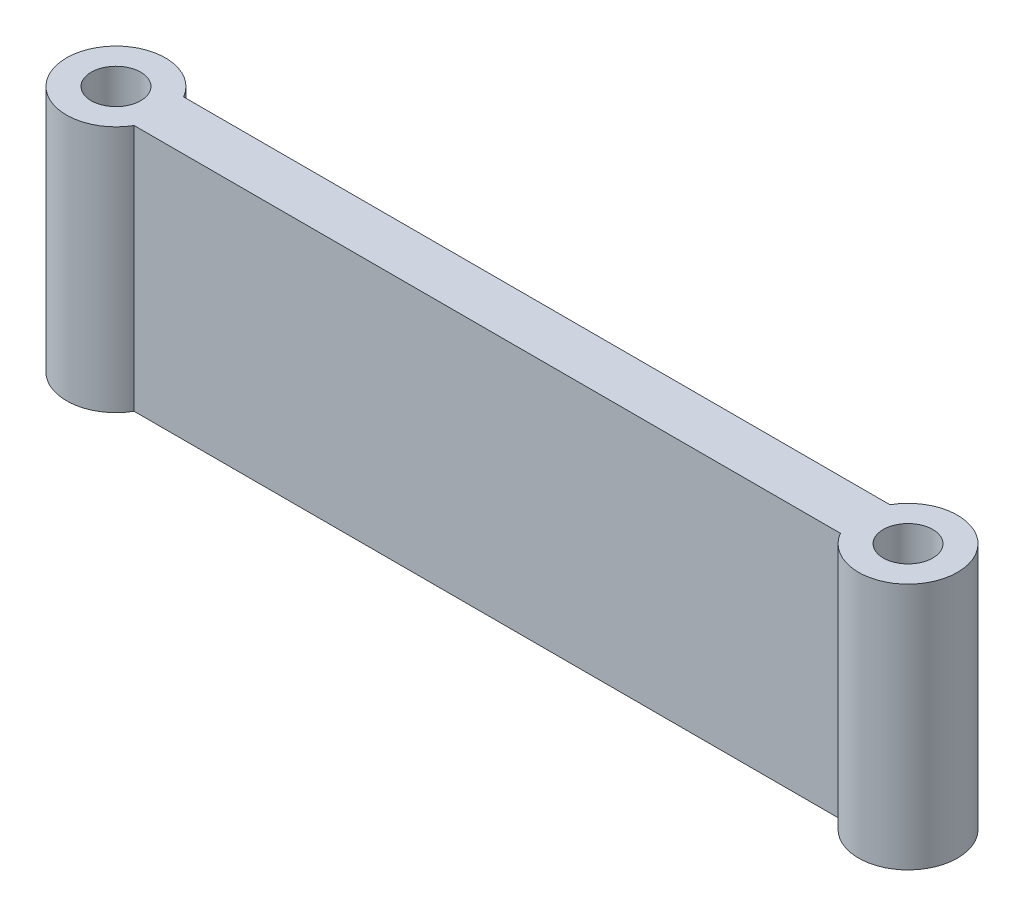
ISO-10303-21;
HEADER;
FILE_DESCRIPTION(('STEP AP214'),'2;1');
FILE_NAME('part.step','',(''),(''),'','','');
FILE_SCHEMA(('AUTOMOTIVE_DESIGN { 1 0 10303 214 1 1 1 1 }'));
ENDSEC;
DATA;
#1=APPLICATION_CONTEXT('core data for automotive mechanical design processes');
#2=APPLICATION_PROTOCOL_DEFINITION('international standard','automotive_design',2000,#1);
#3=PRODUCT_CONTEXT('',#1,'mechanical');
#4=PRODUCT('Part','Part','',(#3));
#5=PRODUCT_RELATED_PRODUCT_CATEGORY('part','',(#4));
#6=PRODUCT_DEFINITION_FORMATION('','',#4);
#7=PRODUCT_DEFINITION_CONTEXT('part definition',#1,'design');
#8=PRODUCT_DEFINITION('design','',#6,#7);
#9=PRODUCT_DEFINITION_SHAPE('','',#8);
#10=(LENGTH_UNIT() NAMED_UNIT(*) SI_UNIT(.MILLI.,.METRE.));
#11=(NAMED_UNIT(*) PLANE_ANGLE_UNIT() SI_UNIT($,.RADIAN.));
#12=(NAMED_UNIT(*) SI_UNIT($,.STERADIAN.) SOLID_ANGLE_UNIT());
#13=UNCERTAINTY_MEASURE_WITH_UNIT(LENGTH_MEASURE(1.E-05),#10,'distance_accuracy_value','');
#14=(GEOMETRIC_REPRESENTATION_CONTEXT(3) GLOBAL_UNCERTAINTY_ASSIGNED_CONTEXT((#13)) GLOBAL_UNIT_ASSIGNED_CONTEXT((#10,
#11,#12)) REPRESENTATION_CONTEXT('',''));
#15=CARTESIAN_POINT('',(0.,0.,0.));
#16=DIRECTION('',(0.,0.,1.));
#17=DIRECTION('',(1.,0.,0.));
#18=AXIS2_PLACEMENT_3D('',#15,#16,#17);
#19=CARTESIAN_POINT('',(0.,12.5,0.));
#20=DIRECTION('',(0.,1.,0.));
#21=DIRECTION('',(0.,0.,1.));
#22=AXIS2_PLACEMENT_3D('',#19,#20,#21);
#23=PLANE('',#22);
#24=CARTESIAN_POINT('',(0.,12.5,0.));
#25=DIRECTION('',(0.,1.,0.));
#26=DIRECTION('',(0.,0.,1.));
#27=AXIS2_PLACEMENT_3D('',#24,#25,#26);
#28=CIRCLE('',#27,2.5);
#29=CARTESIAN_POINT('',(0.,12.5,2.5));
#30=VERTEX_POINT('',#29);
#31=EDGE_CURVE('E102',#30,#30,#28,.T.);
#32=ORIENTED_EDGE('',*,*,#31,.F.);
#33=EDGE_LOOP('',(#32));
#34=FACE_BOUND('',#33,.T.);
#35=CARTESIAN_POINT('',(0.,12.5,0.));
#36=DIRECTION('',(0.,1.,0.));
#37=DIRECTION('',(0.,0.,1.));
#38=AXIS2_PLACEMENT_3D('',#35,#36,#37);
#39=CIRCLE('',#38,5.);
#40=CARTESIAN_POINT('',(4.33012701892219,12.5,-2.5));
#41=VERTEX_POINT('',#40);
#42=CARTESIAN_POINT('',(4.33012701892219,12.5,2.5));
#43=VERTEX_POINT('',#42);
#44=EDGE_CURVE('E87',#41,#43,#39,.T.);
#45=ORIENTED_EDGE('',*,*,#44,.T.);
#46=DIRECTION('',(1.,0.,0.));
#47=VECTOR('',#46,1.);
#48=CARTESIAN_POINT('',(4.33012701892219,12.5,2.5));
#49=LINE('',#48,#47);
#50=CARTESIAN_POINT('',(75.6698729810778,12.5,2.5));
#51=VERTEX_POINT('',#50);
#52=EDGE_CURVE('E82',#43,#51,#49,.T.);
#53=ORIENTED_EDGE('',*,*,#52,.T.);
#54=CARTESIAN_POINT('',(80.,12.5,0.));
#55=DIRECTION('',(0.,1.,0.));
#56=DIRECTION('',(0.,0.,-1.));
#57=AXIS2_PLACEMENT_3D('',#54,#55,#56);
#58=CIRCLE('',#57,5.00000000000001);
#59=CARTESIAN_POINT('',(75.6698729810778,12.5,-2.5));
#60=VERTEX_POINT('',#59);
#61=EDGE_CURVE('E85',#51,#60,#58,.T.);
#62=ORIENTED_EDGE('',*,*,#61,.T.);
#63=DIRECTION('',(-1.,0.,0.));
#64=VECTOR('',#63,1.);
#65=CARTESIAN_POINT('',(4.33012701892219,12.5,-2.5));
#66=LINE('',#65,#64);
#67=EDGE_CURVE('E52',#60,#41,#66,.T.);
#68=ORIENTED_EDGE('',*,*,#67,.T.);
#69=EDGE_LOOP('',(#45,#53,#62,#68));
#70=FACE_BOUND('',#69,.T.);
#71=CARTESIAN_POINT('',(80.,12.5,0.));
#72=DIRECTION('',(0.,1.,0.));
#73=DIRECTION('',(0.,0.,1.));
#74=AXIS2_PLACEMENT_3D('',#71,#72,#73);
#75=CIRCLE('',#74,2.49999999999999);
#76=CARTESIAN_POINT('',(80.,12.5,2.49999999999999));
#77=VERTEX_POINT('',#76);
#78=EDGE_CURVE('E117',#77,#77,#75,.T.);
#79=ORIENTED_EDGE('',*,*,#78,.F.);
#80=EDGE_LOOP('',(#79));
#81=FACE_BOUND('',#80,.T.);
#82=ADVANCED_FACE('F35',(#34,#70,#81),#23,.T.);
#83=CARTESIAN_POINT('',(0.,-12.5,0.));
#84=DIRECTION('',(0.,1.,0.));
#85=DIRECTION('',(0.,0.,1.));
#86=AXIS2_PLACEMENT_3D('',#83,#84,#85);
#87=PLANE('',#86);
#88=CARTESIAN_POINT('',(0.,-12.5,0.));
#89=DIRECTION('',(0.,1.,0.));
#90=DIRECTION('',(0.,0.,1.));
#91=AXIS2_PLACEMENT_3D('',#88,#89,#90);
#92=CIRCLE('',#91,5.);
#93=CARTESIAN_POINT('',(4.33012701892219,-12.5,-2.5));
#94=VERTEX_POINT('',#93);
#95=CARTESIAN_POINT('',(4.33012701892219,-12.5,2.5));
#96=VERTEX_POINT('',#95);
#97=EDGE_CURVE('E99',#94,#96,#92,.T.);
#98=ORIENTED_EDGE('',*,*,#97,.F.);
#99=DIRECTION('',(-1.,0.,0.));
#100=VECTOR('',#99,1.);
#101=CARTESIAN_POINT('',(4.33012701892219,-12.5,-2.5));
#102=LINE('',#101,#100);
#103=CARTESIAN_POINT('',(75.6698729810778,-12.5,-2.5));
#104=VERTEX_POINT('',#103);
#105=EDGE_CURVE('E75',#104,#94,#102,.T.);
#106=ORIENTED_EDGE('',*,*,#105,.F.);
#107=CARTESIAN_POINT('',(80.,-12.5,0.));
#108=DIRECTION('',(0.,1.,0.));
#109=DIRECTION('',(0.,0.,-1.));
#110=AXIS2_PLACEMENT_3D('',#107,#108,#109);
#111=CIRCLE('',#110,5.00000000000001);
#112=CARTESIAN_POINT('',(75.6698729810778,-12.5,2.5));
#113=VERTEX_POINT('',#112);
#114=EDGE_CURVE('E69',#113,#104,#111,.T.);
#115=ORIENTED_EDGE('',*,*,#114,.F.);
#116=DIRECTION('',(1.,0.,0.));
#117=VECTOR('',#116,1.);
#118=CARTESIAN_POINT('',(4.33012701892219,-12.5,2.5));
#119=LINE('',#118,#117);
#120=EDGE_CURVE('E91',#96,#113,#119,.T.);
#121=ORIENTED_EDGE('',*,*,#120,.F.);
#122=EDGE_LOOP('',(#98,#106,#115,#121));
#123=FACE_BOUND('',#122,.T.);
#124=CARTESIAN_POINT('',(0.,-12.5,0.));
#125=DIRECTION('',(0.,1.,0.));
#126=DIRECTION('',(0.,0.,1.));
#127=AXIS2_PLACEMENT_3D('',#124,#125,#126);
#128=CIRCLE('',#127,2.5);
#129=CARTESIAN_POINT('',(0.,-12.5,2.5));
#130=VERTEX_POINT('',#129);
#131=EDGE_CURVE('E114',#130,#130,#128,.T.);
#132=ORIENTED_EDGE('',*,*,#131,.T.);
#133=EDGE_LOOP('',(#132));
#134=FACE_BOUND('',#133,.T.);
#135=CARTESIAN_POINT('',(80.,-12.5,0.));
#136=DIRECTION('',(0.,1.,0.));
#137=DIRECTION('',(0.,0.,1.));
#138=AXIS2_PLACEMENT_3D('',#135,#136,#137);
#139=CIRCLE('',#138,2.49999999999999);
#140=CARTESIAN_POINT('',(80.,-12.5,2.49999999999999));
#141=VERTEX_POINT('',#140);
#142=EDGE_CURVE('E120',#141,#141,#139,.T.);
#143=ORIENTED_EDGE('',*,*,#142,.T.);
#144=EDGE_LOOP('',(#143));
#145=FACE_BOUND('',#144,.T.);
#146=ADVANCED_FACE('F110',(#123,#134,#145),#87,.F.);
#147=CARTESIAN_POINT('',(0.,12.5,0.));
#148=DIRECTION('',(0.,-1.,0.));
#149=DIRECTION('',(0.,0.,-1.));
#150=AXIS2_PLACEMENT_3D('',#147,#148,#149);
#151=CYLINDRICAL_SURFACE('',#150,5.);
#152=ORIENTED_EDGE('',*,*,#97,.T.);
#153=DIRECTION('',(0.,-1.,0.));
#154=VECTOR('',#153,1.);
#155=CARTESIAN_POINT('',(4.33012701892219,12.5,2.5));
#156=LINE('',#155,#154);
#157=EDGE_CURVE('E11',#43,#96,#156,.T.);
#158=ORIENTED_EDGE('',*,*,#157,.F.);
#159=ORIENTED_EDGE('',*,*,#44,.F.);
#160=DIRECTION('',(0.,-1.,0.));
#161=VECTOR('',#160,1.);
#162=CARTESIAN_POINT('',(4.33012701892219,12.5,-2.5));
#163=LINE('',#162,#161);
#164=EDGE_CURVE('E95',#41,#94,#163,.T.);
#165=ORIENTED_EDGE('',*,*,#164,.T.);
#166=EDGE_LOOP('',(#152,#158,#159,#165));
#167=FACE_BOUND('',#166,.T.);
#168=ADVANCED_FACE('F37',(#167),#151,.T.);
#169=CARTESIAN_POINT('',(4.33012701892219,12.5,2.5));
#170=DIRECTION('',(0.,0.,-1.));
#171=DIRECTION('',(-1.,0.,0.));
#172=AXIS2_PLACEMENT_3D('',#169,#170,#171);
#173=PLANE('',#172);
#174=ORIENTED_EDGE('',*,*,#120,.T.);
#175=DIRECTION('',(0.,-1.,0.));
#176=VECTOR('',#175,1.);
#177=CARTESIAN_POINT('',(75.6698729810778,12.5,2.5));
#178=LINE('',#177,#176);
#179=EDGE_CURVE('E44',#51,#113,#178,.T.);
#180=ORIENTED_EDGE('',*,*,#179,.F.);
#181=ORIENTED_EDGE('',*,*,#52,.F.);
#182=ORIENTED_EDGE('',*,*,#157,.T.);
#183=EDGE_LOOP('',(#174,#180,#181,#182));
#184=FACE_BOUND('',#183,.T.);
#185=ADVANCED_FACE('F90',(#184),#173,.F.);
#186=CARTESIAN_POINT('',(80.,12.5,0.));
#187=DIRECTION('',(0.,-1.,0.));
#188=DIRECTION('',(0.,0.,-1.));
#189=AXIS2_PLACEMENT_3D('',#186,#187,#188);
#190=CYLINDRICAL_SURFACE('',#189,5.00000000000001);
#191=ORIENTED_EDGE('',*,*,#114,.T.);
#192=DIRECTION('',(0.,-1.,0.));
#193=VECTOR('',#192,1.);
#194=CARTESIAN_POINT('',(75.6698729810778,12.5,-2.5));
#195=LINE('',#194,#193);
#196=EDGE_CURVE('E92',#60,#104,#195,.T.);
#197=ORIENTED_EDGE('',*,*,#196,.F.);
#198=ORIENTED_EDGE('',*,*,#61,.F.);
#199=ORIENTED_EDGE('',*,*,#179,.T.);
#200=EDGE_LOOP('',(#191,#197,#198,#199));
#201=FACE_BOUND('',#200,.T.);
#202=ADVANCED_FACE('F93',(#201),#190,.T.);
#203=CARTESIAN_POINT('',(4.33012701892219,12.5,-2.5));
#204=DIRECTION('',(0.,0.,1.));
#205=DIRECTION('',(1.,0.,0.));
#206=AXIS2_PLACEMENT_3D('',#203,#204,#205);
#207=PLANE('',#206);
#208=ORIENTED_EDGE('',*,*,#105,.T.);
#209=ORIENTED_EDGE('',*,*,#164,.F.);
#210=ORIENTED_EDGE('',*,*,#67,.F.);
#211=ORIENTED_EDGE('',*,*,#196,.T.);
#212=EDGE_LOOP('',(#208,#209,#210,#211));
#213=FACE_BOUND('',#212,.T.);
#214=ADVANCED_FACE('F107',(#213),#207,.F.);
#215=CARTESIAN_POINT('',(0.,12.5,0.));
#216=DIRECTION('',(0.,-1.,0.));
#217=DIRECTION('',(0.,0.,-1.));
#218=AXIS2_PLACEMENT_3D('',#215,#216,#217);
#219=CYLINDRICAL_SURFACE('',#218,2.5);
#220=ORIENTED_EDGE('',*,*,#31,.T.);
#221=EDGE_LOOP('',(#220));
#222=FACE_BOUND('',#221,.T.);
#223=ORIENTED_EDGE('',*,*,#131,.F.);
#224=EDGE_LOOP('',(#223));
#225=FACE_BOUND('',#224,.T.);
#226=ADVANCED_FACE('F137',(#222,#225),#219,.F.);
#227=CARTESIAN_POINT('',(80.,12.5,0.));
#228=DIRECTION('',(0.,-1.,0.));
#229=DIRECTION('',(0.,0.,-1.));
#230=AXIS2_PLACEMENT_3D('',#227,#228,#229);
#231=CYLINDRICAL_SURFACE('',#230,2.49999999999999);
#232=ORIENTED_EDGE('',*,*,#78,.T.);
#233=EDGE_LOOP('',(#232));
#234=FACE_BOUND('',#233,.T.);
#235=ORIENTED_EDGE('',*,*,#142,.F.);
#236=EDGE_LOOP('',(#235));
#237=FACE_BOUND('',#236,.T.);
#238=ADVANCED_FACE('F126',(#234,#237),#231,.F.);
#239=CLOSED_SHELL('',(#82,#146,#168,#185,#202,#214,#226,#238));
#240=MANIFOLD_SOLID_BREP('B2',#239);
#241=ADVANCED_BREP_SHAPE_REPRESENTATION('',(#18,#240),#14);
#242=SHAPE_DEFINITION_REPRESENTATION(#9,#241);
ENDSEC;
END-ISO-10303-21;
